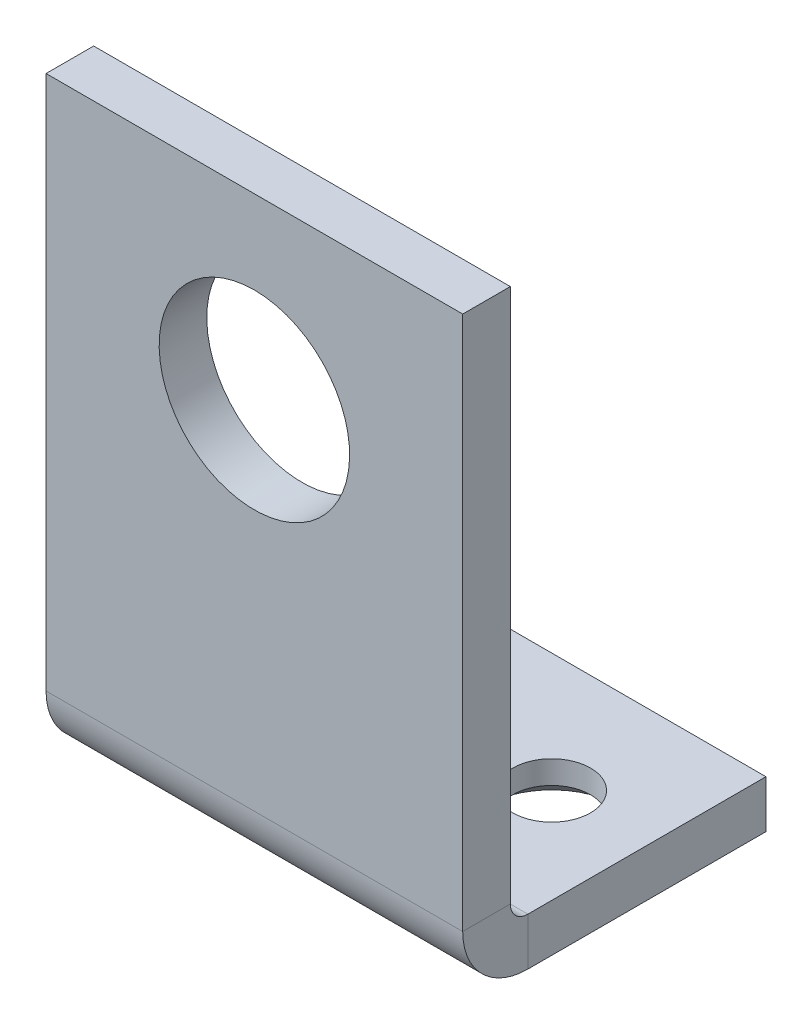
ISO-10303-21;
HEADER;
FILE_DESCRIPTION(('STEP AP214'),'2;1');
FILE_NAME('part.step','',(''),(''),'','','');
FILE_SCHEMA(('AUTOMOTIVE_DESIGN { 1 0 10303 214 1 1 1 1 }'));
ENDSEC;
DATA;
#1=APPLICATION_CONTEXT('core data for automotive mechanical design processes');
#2=APPLICATION_PROTOCOL_DEFINITION('international standard','automotive_design',2000,#1);
#3=PRODUCT_CONTEXT('',#1,'mechanical');
#4=PRODUCT('Part','Part','',(#3));
#5=PRODUCT_RELATED_PRODUCT_CATEGORY('part','',(#4));
#6=PRODUCT_DEFINITION_FORMATION('','',#4);
#7=PRODUCT_DEFINITION_CONTEXT('part definition',#1,'design');
#8=PRODUCT_DEFINITION('design','',#6,#7);
#9=PRODUCT_DEFINITION_SHAPE('','',#8);
#10=(LENGTH_UNIT() NAMED_UNIT(*) SI_UNIT(.MILLI.,.METRE.));
#11=(NAMED_UNIT(*) PLANE_ANGLE_UNIT() SI_UNIT($,.RADIAN.));
#12=(NAMED_UNIT(*) SI_UNIT($,.STERADIAN.) SOLID_ANGLE_UNIT());
#13=UNCERTAINTY_MEASURE_WITH_UNIT(LENGTH_MEASURE(1.E-05),#10,'distance_accuracy_value','');
#14=(GEOMETRIC_REPRESENTATION_CONTEXT(3) GLOBAL_UNCERTAINTY_ASSIGNED_CONTEXT((#13)) GLOBAL_UNIT_ASSIGNED_CONTEXT((#10,
#11,#12)) REPRESENTATION_CONTEXT('',''));
#15=CARTESIAN_POINT('',(0.,0.,0.));
#16=DIRECTION('',(0.,0.,1.));
#17=DIRECTION('',(1.,0.,0.));
#18=AXIS2_PLACEMENT_3D('',#15,#16,#17);
#19=CARTESIAN_POINT('',(0.,0.,0.));
#20=DIRECTION('',(0.,1.,0.));
#21=DIRECTION('',(0.,0.,1.));
#22=AXIS2_PLACEMENT_3D('',#19,#20,#21);
#23=PLANE('',#22);
#24=CARTESIAN_POINT('',(-19.2867132867133,0.,-16.3298368298368));
#25=DIRECTION('',(0.,1.,0.));
#26=DIRECTION('',(0.,0.,1.));
#27=AXIS2_PLACEMENT_3D('',#24,#25,#26);
#28=CIRCLE('',#27,1.63195);
#29=CARTESIAN_POINT('',(-19.2867132867133,0.,-14.6978868298368));
#30=VERTEX_POINT('',#29);
#31=EDGE_CURVE('E402',#30,#30,#28,.F.);
#32=ORIENTED_EDGE('',*,*,#31,.T.);
#33=EDGE_LOOP('',(#32));
#34=FACE_BOUND('',#33,.T.);
#35=DIRECTION('',(-1.,0.,0.));
#36=VECTOR('',#35,1.);
#37=CARTESIAN_POINT('',(0.,0.,-11.3298368298368));
#38=LINE('',#37,#36);
#39=CARTESIAN_POINT('',(-5.78671328671329,0.,-11.3298368298368));
#40=VERTEX_POINT('',#39);
#41=CARTESIAN_POINT('',(-23.2867132867133,0.,-11.3298368298368));
#42=VERTEX_POINT('',#41);
#43=EDGE_CURVE('E148',#40,#42,#38,.T.);
#44=ORIENTED_EDGE('',*,*,#43,.F.);
#45=DIRECTION('',(0.,0.,-1.));
#46=VECTOR('',#45,1.);
#47=CARTESIAN_POINT('',(-5.78671328671329,0.,-21.3298368298368));
#48=LINE('',#47,#46);
#49=CARTESIAN_POINT('',(-5.78671328671329,0.,-21.3298368298368));
#50=VERTEX_POINT('',#49);
#51=EDGE_CURVE('E170',#40,#50,#48,.T.);
#52=ORIENTED_EDGE('',*,*,#51,.T.);
#53=DIRECTION('',(-1.,0.,0.));
#54=VECTOR('',#53,1.);
#55=CARTESIAN_POINT('',(-23.2867132867133,0.,-21.3298368298368));
#56=LINE('',#55,#54);
#57=CARTESIAN_POINT('',(-23.2867132867133,0.,-21.3298368298368));
#58=VERTEX_POINT('',#57);
#59=EDGE_CURVE('E167',#50,#58,#56,.T.);
#60=ORIENTED_EDGE('',*,*,#59,.T.);
#61=DIRECTION('',(0.,0.,1.));
#62=VECTOR('',#61,1.);
#63=CARTESIAN_POINT('',(-23.2867132867133,0.,-21.3298368298368));
#64=LINE('',#63,#62);
#65=EDGE_CURVE('E165',#58,#42,#64,.T.);
#66=ORIENTED_EDGE('',*,*,#65,.T.);
#67=EDGE_LOOP('',(#44,#52,#60,#66));
#68=FACE_BOUND('',#67,.T.);
#69=CARTESIAN_POINT('',(-9.78671328671329,0.,-16.3298368298368));
#70=DIRECTION('',(0.,1.,0.));
#71=DIRECTION('',(0.,0.,1.));
#72=AXIS2_PLACEMENT_3D('',#69,#70,#71);
#73=CIRCLE('',#72,1.63195);
#74=CARTESIAN_POINT('',(-9.78671328671329,0.,-14.6978868298368));
#75=VERTEX_POINT('',#74);
#76=EDGE_CURVE('E409',#75,#75,#73,.F.);
#77=ORIENTED_EDGE('',*,*,#76,.T.);
#78=EDGE_LOOP('',(#77));
#79=FACE_BOUND('',#78,.T.);
#80=ADVANCED_FACE('F47',(#34,#68,#79),#23,.T.);
#81=CARTESIAN_POINT('',(-23.2867132867133,-11.8027493418966,-8.59323682983679));
#82=DIRECTION('',(-1.,0.,0.));
#83=DIRECTION('',(0.,1.,0.));
#84=AXIS2_PLACEMENT_3D('',#81,#82,#83);
#85=PLANE('',#84);
#86=DIRECTION('',(0.,1.,0.));
#87=VECTOR('',#86,1.);
#88=CARTESIAN_POINT('',(-23.2867132867133,-11.8027493418966,-10.5932368298368));
#89=LINE('',#88,#87);
#90=CARTESIAN_POINT('',(-23.2867132867133,0.736600000000002,-10.5932368298368));
#91=VERTEX_POINT('',#90);
#92=CARTESIAN_POINT('',(-23.2867132867133,23.1972506581034,-10.5932368298369));
#93=VERTEX_POINT('',#92);
#94=EDGE_CURVE('E71',#91,#93,#89,.T.);
#95=ORIENTED_EDGE('',*,*,#94,.F.);
#96=DIRECTION('',(0.,0.,1.));
#97=VECTOR('',#96,1.);
#98=CARTESIAN_POINT('',(-23.2867132867133,0.736600000000009,-8.59323682983683));
#99=LINE('',#98,#97);
#100=CARTESIAN_POINT('',(-23.2867132867133,0.73660000000001,-8.59323682983683));
#101=VERTEX_POINT('',#100);
#102=EDGE_CURVE('E112',#91,#101,#99,.T.);
#103=ORIENTED_EDGE('',*,*,#102,.T.);
#104=DIRECTION('',(0.,1.,0.));
#105=VECTOR('',#104,1.);
#106=CARTESIAN_POINT('',(-23.2867132867133,-11.8027493418966,-8.59323682983679));
#107=LINE('',#106,#105);
#108=CARTESIAN_POINT('',(-23.2867132867133,23.1972506581034,-8.59323682983691));
#109=VERTEX_POINT('',#108);
#110=EDGE_CURVE('E51',#101,#109,#107,.T.);
#111=ORIENTED_EDGE('',*,*,#110,.T.);
#112=DIRECTION('',(0.,0.,-1.));
#113=VECTOR('',#112,1.);
#114=CARTESIAN_POINT('',(-23.2867132867133,23.1972506581034,-8.59323682983691));
#115=LINE('',#114,#113);
#116=EDGE_CURVE('E195',#109,#93,#115,.T.);
#117=ORIENTED_EDGE('',*,*,#116,.T.);
#118=EDGE_LOOP('',(#95,#103,#111,#117));
#119=FACE_BOUND('',#118,.T.);
#120=ADVANCED_FACE('F114',(#119),#85,.T.);
#121=CARTESIAN_POINT('',(-5.78671328671329,-11.8027493418966,-8.59323682983679));
#122=DIRECTION('',(1.,0.,0.));
#123=DIRECTION('',(0.,-1.,0.));
#124=AXIS2_PLACEMENT_3D('',#121,#122,#123);
#125=PLANE('',#124);
#126=DIRECTION('',(0.,-1.,0.));
#127=VECTOR('',#126,1.);
#128=CARTESIAN_POINT('',(-5.78671328671329,-11.8027493418966,-8.59323682983679));
#129=LINE('',#128,#127);
#130=CARTESIAN_POINT('',(-5.78671328671328,23.1972506581034,-8.59323682983691));
#131=VERTEX_POINT('',#130);
#132=CARTESIAN_POINT('',(-5.78671328671329,0.736600000000009,-8.59323682983683));
#133=VERTEX_POINT('',#132);
#134=EDGE_CURVE('E191',#131,#133,#129,.T.);
#135=ORIENTED_EDGE('',*,*,#134,.T.);
#136=DIRECTION('',(0.,0.,-1.));
#137=VECTOR('',#136,1.);
#138=CARTESIAN_POINT('',(-5.78671328671329,0.736600000000009,-8.59323682983683));
#139=LINE('',#138,#137);
#140=CARTESIAN_POINT('',(-5.78671328671329,0.736600000000002,-10.5932368298368));
#141=VERTEX_POINT('',#140);
#142=EDGE_CURVE('E12',#133,#141,#139,.T.);
#143=ORIENTED_EDGE('',*,*,#142,.T.);
#144=DIRECTION('',(0.,-1.,0.));
#145=VECTOR('',#144,1.);
#146=CARTESIAN_POINT('',(-5.78671328671329,-11.8027493418966,-10.5932368298368));
#147=LINE('',#146,#145);
#148=CARTESIAN_POINT('',(-5.78671328671328,23.1972506581034,-10.5932368298369));
#149=VERTEX_POINT('',#148);
#150=EDGE_CURVE('E64',#149,#141,#147,.T.);
#151=ORIENTED_EDGE('',*,*,#150,.F.);
#152=DIRECTION('',(0.,0.,-1.));
#153=VECTOR('',#152,1.);
#154=CARTESIAN_POINT('',(-5.78671328671328,23.1972506581034,-8.59323682983691));
#155=LINE('',#154,#153);
#156=EDGE_CURVE('E139',#131,#149,#155,.T.);
#157=ORIENTED_EDGE('',*,*,#156,.F.);
#158=EDGE_LOOP('',(#135,#143,#151,#157));
#159=FACE_BOUND('',#158,.T.);
#160=ADVANCED_FACE('F49',(#159),#125,.T.);
#161=CARTESIAN_POINT('',(0.,9.52708748794019,-10.5932368298369));
#162=DIRECTION('',(0.,0.,-1.));
#163=DIRECTION('',(0.,1.,0.));
#164=AXIS2_PLACEMENT_3D('',#161,#162,#163);
#165=PLANE('',#164);
#166=CARTESIAN_POINT('',(-14.5367132867133,15.6972506581034,-10.5932368298369));
#167=DIRECTION('',(0.,0.,-1.));
#168=DIRECTION('',(0.,1.,0.));
#169=AXIS2_PLACEMENT_3D('',#166,#167,#168);
#170=CIRCLE('',#169,4.);
#171=CARTESIAN_POINT('',(-14.5367132867133,19.6972506581034,-10.5932368298369));
#172=VERTEX_POINT('',#171);
#173=EDGE_CURVE('E162',#172,#172,#170,.T.);
#174=ORIENTED_EDGE('',*,*,#173,.F.);
#175=EDGE_LOOP('',(#174));
#176=FACE_BOUND('',#175,.T.);
#177=ORIENTED_EDGE('',*,*,#150,.T.);
#178=DIRECTION('',(-1.,0.,0.));
#179=VECTOR('',#178,1.);
#180=CARTESIAN_POINT('',(0.,0.736600000000002,-10.5932368298368));
#181=LINE('',#180,#179);
#182=EDGE_CURVE('E56',#141,#91,#181,.T.);
#183=ORIENTED_EDGE('',*,*,#182,.T.);
#184=ORIENTED_EDGE('',*,*,#94,.T.);
#185=DIRECTION('',(1.,0.,0.));
#186=VECTOR('',#185,1.);
#187=CARTESIAN_POINT('',(-23.2867132867133,23.1972506581034,-10.5932368298369));
#188=LINE('',#187,#186);
#189=EDGE_CURVE('E192',#93,#149,#188,.T.);
#190=ORIENTED_EDGE('',*,*,#189,.T.);
#191=EDGE_LOOP('',(#177,#183,#184,#190));
#192=FACE_BOUND('',#191,.T.);
#193=ADVANCED_FACE('F199',(#176,#192),#165,.T.);
#194=CARTESIAN_POINT('',(-23.2867132867133,23.1972506581034,-8.59323682983691));
#195=DIRECTION('',(0.,1.,0.));
#196=DIRECTION('',(1.,0.,0.));
#197=AXIS2_PLACEMENT_3D('',#194,#195,#196);
#198=PLANE('',#197);
#199=ORIENTED_EDGE('',*,*,#189,.F.);
#200=ORIENTED_EDGE('',*,*,#116,.F.);
#201=DIRECTION('',(1.,0.,0.));
#202=VECTOR('',#201,1.);
#203=CARTESIAN_POINT('',(-23.2867132867133,23.1972506581034,-8.59323682983691));
#204=LINE('',#203,#202);
#205=EDGE_CURVE('E130',#109,#131,#204,.T.);
#206=ORIENTED_EDGE('',*,*,#205,.T.);
#207=ORIENTED_EDGE('',*,*,#156,.T.);
#208=EDGE_LOOP('',(#199,#200,#206,#207));
#209=FACE_BOUND('',#208,.T.);
#210=ADVANCED_FACE('F203',(#209),#198,.T.);
#211=CARTESIAN_POINT('',(0.,9.5270874879402,-8.59323682983686));
#212=DIRECTION('',(0.,0.,-1.));
#213=DIRECTION('',(0.,1.,0.));
#214=AXIS2_PLACEMENT_3D('',#211,#212,#213);
#215=PLANE('',#214);
#216=DIRECTION('',(-1.,0.,0.));
#217=VECTOR('',#216,1.);
#218=CARTESIAN_POINT('',(0.,0.736600000000009,-8.59323682983683));
#219=LINE('',#218,#217);
#220=EDGE_CURVE('E120',#133,#101,#219,.T.);
#221=ORIENTED_EDGE('',*,*,#220,.F.);
#222=ORIENTED_EDGE('',*,*,#134,.F.);
#223=ORIENTED_EDGE('',*,*,#205,.F.);
#224=ORIENTED_EDGE('',*,*,#110,.F.);
#225=EDGE_LOOP('',(#221,#222,#223,#224));
#226=FACE_BOUND('',#225,.T.);
#227=CARTESIAN_POINT('',(-14.5367132867133,15.6972506581034,-8.59323682983688));
#228=DIRECTION('',(0.,0.,-1.));
#229=DIRECTION('',(0.,1.,0.));
#230=AXIS2_PLACEMENT_3D('',#227,#228,#229);
#231=CIRCLE('',#230,4.);
#232=CARTESIAN_POINT('',(-14.5367132867133,19.6972506581034,-8.59323682983689));
#233=VERTEX_POINT('',#232);
#234=EDGE_CURVE('E187',#233,#233,#231,.F.);
#235=ORIENTED_EDGE('',*,*,#234,.F.);
#236=EDGE_LOOP('',(#235));
#237=FACE_BOUND('',#236,.T.);
#238=ADVANCED_FACE('F125',(#226,#237),#215,.F.);
#239=CARTESIAN_POINT('',(-14.5367132867133,15.6972506581034,2.72047166914788));
#240=DIRECTION('',(0.,0.,-1.));
#241=DIRECTION('',(0.,1.,0.));
#242=AXIS2_PLACEMENT_3D('',#239,#240,#241);
#243=CYLINDRICAL_SURFACE('',#242,4.);
#244=ORIENTED_EDGE('',*,*,#234,.T.);
#245=EDGE_LOOP('',(#244));
#246=FACE_BOUND('',#245,.T.);
#247=ORIENTED_EDGE('',*,*,#173,.T.);
#248=EDGE_LOOP('',(#247));
#249=FACE_BOUND('',#248,.T.);
#250=ADVANCED_FACE('F229',(#246,#249),#243,.F.);
#251=CARTESIAN_POINT('',(-23.2867132867133,-2.,-21.3298368298368));
#252=DIRECTION('',(0.,0.,-1.));
#253=DIRECTION('',(-1.,0.,0.));
#254=AXIS2_PLACEMENT_3D('',#251,#252,#253);
#255=PLANE('',#254);
#256=ORIENTED_EDGE('',*,*,#59,.F.);
#257=DIRECTION('',(0.,1.,0.));
#258=VECTOR('',#257,1.);
#259=CARTESIAN_POINT('',(-5.78671328671329,-2.,-21.3298368298368));
#260=LINE('',#259,#258);
#261=CARTESIAN_POINT('',(-5.78671328671329,-2.,-21.3298368298368));
#262=VERTEX_POINT('',#261);
#263=EDGE_CURVE('E159',#262,#50,#260,.T.);
#264=ORIENTED_EDGE('',*,*,#263,.F.);
#265=DIRECTION('',(-1.,0.,0.));
#266=VECTOR('',#265,1.);
#267=CARTESIAN_POINT('',(-23.2867132867133,-2.,-21.3298368298368));
#268=LINE('',#267,#266);
#269=CARTESIAN_POINT('',(-23.2867132867133,-2.,-21.3298368298368));
#270=VERTEX_POINT('',#269);
#271=EDGE_CURVE('E179',#262,#270,#268,.T.);
#272=ORIENTED_EDGE('',*,*,#271,.T.);
#273=DIRECTION('',(0.,1.,0.));
#274=VECTOR('',#273,1.);
#275=CARTESIAN_POINT('',(-23.2867132867133,-2.,-21.3298368298368));
#276=LINE('',#275,#274);
#277=EDGE_CURVE('E177',#270,#58,#276,.T.);
#278=ORIENTED_EDGE('',*,*,#277,.T.);
#279=EDGE_LOOP('',(#256,#264,#272,#278));
#280=FACE_BOUND('',#279,.T.);
#281=ADVANCED_FACE('F227',(#280),#255,.T.);
#282=CARTESIAN_POINT('',(0.,-2.,0.));
#283=DIRECTION('',(0.,1.,0.));
#284=DIRECTION('',(0.,0.,1.));
#285=AXIS2_PLACEMENT_3D('',#282,#283,#284);
#286=PLANE('',#285);
#287=CARTESIAN_POINT('',(-19.2867132867133,-2.,-16.3298368298368));
#288=DIRECTION('',(0.,-1.,0.));
#289=DIRECTION('',(0.,0.,-1.));
#290=AXIS2_PLACEMENT_3D('',#287,#288,#289);
#291=CIRCLE('',#290,2.8575);
#292=CARTESIAN_POINT('',(-19.2867132867133,-2.,-19.1873368298368));
#293=VERTEX_POINT('',#292);
#294=EDGE_CURVE('E401',#293,#293,#291,.T.);
#295=ORIENTED_EDGE('',*,*,#294,.F.);
#296=EDGE_LOOP('',(#295));
#297=FACE_BOUND('',#296,.T.);
#298=CARTESIAN_POINT('',(-9.78671328671329,-2.,-16.3298368298368));
#299=DIRECTION('',(0.,-1.,0.));
#300=DIRECTION('',(0.,0.,-1.));
#301=AXIS2_PLACEMENT_3D('',#298,#299,#300);
#302=CIRCLE('',#301,2.8575);
#303=CARTESIAN_POINT('',(-9.78671328671329,-2.,-19.1873368298368));
#304=VERTEX_POINT('',#303);
#305=EDGE_CURVE('E410',#304,#304,#302,.T.);
#306=ORIENTED_EDGE('',*,*,#305,.F.);
#307=EDGE_LOOP('',(#306));
#308=FACE_BOUND('',#307,.T.);
#309=DIRECTION('',(0.,0.,-1.));
#310=VECTOR('',#309,1.);
#311=CARTESIAN_POINT('',(-5.78671328671329,-2.,-21.3298368298368));
#312=LINE('',#311,#310);
#313=CARTESIAN_POINT('',(-5.78671328671329,-2.,-11.3298368298368));
#314=VERTEX_POINT('',#313);
#315=EDGE_CURVE('E163',#314,#262,#312,.T.);
#316=ORIENTED_EDGE('',*,*,#315,.F.);
#317=DIRECTION('',(-1.,0.,0.));
#318=VECTOR('',#317,1.);
#319=CARTESIAN_POINT('',(0.,-2.,-11.3298368298368));
#320=LINE('',#319,#318);
#321=CARTESIAN_POINT('',(-23.2867132867133,-2.,-11.3298368298368));
#322=VERTEX_POINT('',#321);
#323=EDGE_CURVE('E174',#314,#322,#320,.T.);
#324=ORIENTED_EDGE('',*,*,#323,.T.);
#325=DIRECTION('',(0.,0.,1.));
#326=VECTOR('',#325,1.);
#327=CARTESIAN_POINT('',(-23.2867132867133,-2.,-21.3298368298368));
#328=LINE('',#327,#326);
#329=EDGE_CURVE('E172',#270,#322,#328,.T.);
#330=ORIENTED_EDGE('',*,*,#329,.F.);
#331=ORIENTED_EDGE('',*,*,#271,.F.);
#332=EDGE_LOOP('',(#316,#324,#330,#331));
#333=FACE_BOUND('',#332,.T.);
#334=ADVANCED_FACE('F225',(#297,#308,#333),#286,.F.);
#335=CARTESIAN_POINT('',(-23.2867132867133,-2.,-21.3298368298368));
#336=DIRECTION('',(-1.,0.,0.));
#337=DIRECTION('',(0.,0.,1.));
#338=AXIS2_PLACEMENT_3D('',#335,#336,#337);
#339=PLANE('',#338);
#340=DIRECTION('',(0.,-1.,0.));
#341=VECTOR('',#340,1.);
#342=CARTESIAN_POINT('',(-23.2867132867133,-2.,-11.3298368298368));
#343=LINE('',#342,#341);
#344=EDGE_CURVE('E144',#42,#322,#343,.T.);
#345=ORIENTED_EDGE('',*,*,#344,.F.);
#346=ORIENTED_EDGE('',*,*,#65,.F.);
#347=ORIENTED_EDGE('',*,*,#277,.F.);
#348=ORIENTED_EDGE('',*,*,#329,.T.);
#349=EDGE_LOOP('',(#345,#346,#347,#348));
#350=FACE_BOUND('',#349,.T.);
#351=ADVANCED_FACE('F221',(#350),#339,.T.);
#352=CARTESIAN_POINT('',(-5.78671328671329,-2.,-21.3298368298368));
#353=DIRECTION('',(1.,0.,0.));
#354=DIRECTION('',(0.,0.,-1.));
#355=AXIS2_PLACEMENT_3D('',#352,#353,#354);
#356=PLANE('',#355);
#357=DIRECTION('',(0.,1.,0.));
#358=VECTOR('',#357,1.);
#359=CARTESIAN_POINT('',(-5.78671328671329,-2.,-11.3298368298368));
#360=LINE('',#359,#358);
#361=EDGE_CURVE('E145',#314,#40,#360,.T.);
#362=ORIENTED_EDGE('',*,*,#361,.F.);
#363=ORIENTED_EDGE('',*,*,#315,.T.);
#364=ORIENTED_EDGE('',*,*,#263,.T.);
#365=ORIENTED_EDGE('',*,*,#51,.F.);
#366=EDGE_LOOP('',(#362,#363,#364,#365));
#367=FACE_BOUND('',#366,.T.);
#368=ADVANCED_FACE('F213',(#367),#356,.T.);
#369=CARTESIAN_POINT('',(-5.78671328671329,0.7366,-11.3298368298368));
#370=DIRECTION('',(1.,0.,0.));
#371=DIRECTION('',(0.,0.,-1.));
#372=AXIS2_PLACEMENT_3D('',#369,#370,#371);
#373=PLANE('',#372);
#374=ORIENTED_EDGE('',*,*,#361,.T.);
#375=CARTESIAN_POINT('',(-5.78671328671329,0.7366,-11.3298368298368));
#376=DIRECTION('',(-1.,0.,0.));
#377=DIRECTION('',(0.,0.,1.));
#378=AXIS2_PLACEMENT_3D('',#375,#376,#377);
#379=CIRCLE('',#378,0.7366);
#380=EDGE_CURVE('E155',#40,#141,#379,.T.);
#381=ORIENTED_EDGE('',*,*,#380,.T.);
#382=ORIENTED_EDGE('',*,*,#142,.F.);
#383=CARTESIAN_POINT('',(-5.78671328671329,0.7366,-11.3298368298368));
#384=DIRECTION('',(-1.,0.,0.));
#385=DIRECTION('',(0.,0.,-1.));
#386=AXIS2_PLACEMENT_3D('',#383,#384,#385);
#387=CIRCLE('',#386,2.7366);
#388=EDGE_CURVE('E138',#314,#133,#387,.T.);
#389=ORIENTED_EDGE('',*,*,#388,.F.);
#390=EDGE_LOOP('',(#374,#381,#382,#389));
#391=FACE_BOUND('',#390,.T.);
#392=ADVANCED_FACE('F210',(#391),#373,.T.);
#393=CARTESIAN_POINT('',(-23.2867132867133,0.7366,-11.3298368298368));
#394=DIRECTION('',(-1.,0.,0.));
#395=DIRECTION('',(0.,0.,1.));
#396=AXIS2_PLACEMENT_3D('',#393,#394,#395);
#397=PLANE('',#396);
#398=ORIENTED_EDGE('',*,*,#102,.F.);
#399=CARTESIAN_POINT('',(-23.2867132867133,0.7366,-11.3298368298368));
#400=DIRECTION('',(-1.,0.,0.));
#401=DIRECTION('',(0.,0.,1.));
#402=AXIS2_PLACEMENT_3D('',#399,#400,#401);
#403=CIRCLE('',#402,0.7366);
#404=EDGE_CURVE('E150',#91,#42,#403,.F.);
#405=ORIENTED_EDGE('',*,*,#404,.T.);
#406=ORIENTED_EDGE('',*,*,#344,.T.);
#407=CARTESIAN_POINT('',(-23.2867132867133,0.7366,-11.3298368298368));
#408=DIRECTION('',(1.,0.,0.));
#409=DIRECTION('',(0.,0.,1.));
#410=AXIS2_PLACEMENT_3D('',#407,#408,#409);
#411=CIRCLE('',#410,2.7366);
#412=EDGE_CURVE('E136',#101,#322,#411,.T.);
#413=ORIENTED_EDGE('',*,*,#412,.F.);
#414=EDGE_LOOP('',(#398,#405,#406,#413));
#415=FACE_BOUND('',#414,.T.);
#416=ADVANCED_FACE('F142',(#415),#397,.T.);
#417=CARTESIAN_POINT('',(3.25930579285029,0.7366,-11.3298368298368));
#418=DIRECTION('',(-1.,0.,0.));
#419=DIRECTION('',(0.,0.,1.));
#420=AXIS2_PLACEMENT_3D('',#417,#418,#419);
#421=CYLINDRICAL_SURFACE('',#420,2.7366);
#422=ORIENTED_EDGE('',*,*,#412,.T.);
#423=ORIENTED_EDGE('',*,*,#323,.F.);
#424=ORIENTED_EDGE('',*,*,#388,.T.);
#425=ORIENTED_EDGE('',*,*,#220,.T.);
#426=EDGE_LOOP('',(#422,#423,#424,#425));
#427=FACE_BOUND('',#426,.T.);
#428=ADVANCED_FACE('F134',(#427),#421,.T.);
#429=CARTESIAN_POINT('',(3.25930579285029,0.7366,-11.3298368298368));
#430=DIRECTION('',(-1.,0.,0.));
#431=DIRECTION('',(0.,0.,1.));
#432=AXIS2_PLACEMENT_3D('',#429,#430,#431);
#433=CYLINDRICAL_SURFACE('',#432,0.7366);
#434=ORIENTED_EDGE('',*,*,#404,.F.);
#435=ORIENTED_EDGE('',*,*,#182,.F.);
#436=ORIENTED_EDGE('',*,*,#380,.F.);
#437=ORIENTED_EDGE('',*,*,#43,.T.);
#438=EDGE_LOOP('',(#434,#435,#436,#437));
#439=FACE_BOUND('',#438,.T.);
#440=ADVANCED_FACE('F209',(#439),#433,.F.);
#441=CARTESIAN_POINT('',(-9.78671328671329,-2.,-16.3298368298368));
#442=DIRECTION('',(0.,-1.,0.));
#443=DIRECTION('',(0.,0.,-1.));
#444=AXIS2_PLACEMENT_3D('',#441,#442,#443);
#445=CYLINDRICAL_SURFACE('',#444,1.63195);
#446=ORIENTED_EDGE('',*,*,#76,.F.);
#447=EDGE_LOOP('',(#446));
#448=FACE_BOUND('',#447,.T.);
#449=CARTESIAN_POINT('',(-9.78671328671329,-0.971641447010682,-16.3298368298368));
#450=DIRECTION('',(0.,-1.,0.));
#451=DIRECTION('',(0.,0.,-1.));
#452=AXIS2_PLACEMENT_3D('',#449,#450,#451);
#453=CIRCLE('',#452,1.63195);
#454=CARTESIAN_POINT('',(-9.78671328671329,-0.971641447010682,-17.9617868298368));
#455=VERTEX_POINT('',#454);
#456=EDGE_CURVE('E158',#455,#455,#453,.T.);
#457=ORIENTED_EDGE('',*,*,#456,.T.);
#458=EDGE_LOOP('',(#457));
#459=FACE_BOUND('',#458,.T.);
#460=ADVANCED_FACE('F347',(#448,#459),#445,.F.);
#461=CARTESIAN_POINT('',(-9.78671328671329,-2.,-16.3298368298368));
#462=DIRECTION('',(0.,-1.,0.));
#463=DIRECTION('',(0.,0.,-1.));
#464=AXIS2_PLACEMENT_3D('',#461,#462,#463);
#465=CONICAL_SURFACE('',#464,2.8575,0.872664625997164);
#466=ORIENTED_EDGE('',*,*,#456,.F.);
#467=EDGE_LOOP('',(#466));
#468=FACE_BOUND('',#467,.T.);
#469=ORIENTED_EDGE('',*,*,#305,.T.);
#470=EDGE_LOOP('',(#469));
#471=FACE_BOUND('',#470,.T.);
#472=ADVANCED_FACE('F362',(#468,#471),#465,.F.);
#473=CARTESIAN_POINT('',(-19.2867132867133,-2.,-16.3298368298368));
#474=DIRECTION('',(0.,-1.,0.));
#475=DIRECTION('',(0.,0.,-1.));
#476=AXIS2_PLACEMENT_3D('',#473,#474,#475);
#477=CYLINDRICAL_SURFACE('',#476,1.63195);
#478=ORIENTED_EDGE('',*,*,#31,.F.);
#479=EDGE_LOOP('',(#478));
#480=FACE_BOUND('',#479,.T.);
#481=CARTESIAN_POINT('',(-19.2867132867133,-0.971641447010682,-16.3298368298368));
#482=DIRECTION('',(0.,-1.,0.));
#483=DIRECTION('',(0.,0.,-1.));
#484=AXIS2_PLACEMENT_3D('',#481,#482,#483);
#485=CIRCLE('',#484,1.63195);
#486=CARTESIAN_POINT('',(-19.2867132867133,-0.971641447010682,-17.9617868298368));
#487=VERTEX_POINT('',#486);
#488=EDGE_CURVE('E398',#487,#487,#485,.T.);
#489=ORIENTED_EDGE('',*,*,#488,.T.);
#490=EDGE_LOOP('',(#489));
#491=FACE_BOUND('',#490,.T.);
#492=ADVANCED_FACE('F372',(#480,#491),#477,.F.);
#493=CARTESIAN_POINT('',(-19.2867132867133,-2.,-16.3298368298368));
#494=DIRECTION('',(0.,-1.,0.));
#495=DIRECTION('',(0.,0.,-1.));
#496=AXIS2_PLACEMENT_3D('',#493,#494,#495);
#497=CONICAL_SURFACE('',#496,2.8575,0.872664625997164);
#498=ORIENTED_EDGE('',*,*,#488,.F.);
#499=EDGE_LOOP('',(#498));
#500=FACE_BOUND('',#499,.T.);
#501=ORIENTED_EDGE('',*,*,#294,.T.);
#502=EDGE_LOOP('',(#501));
#503=FACE_BOUND('',#502,.T.);
#504=ADVANCED_FACE('F382',(#500,#503),#497,.F.);
#505=CLOSED_SHELL('',(#80,#120,#160,#193,#210,#238,#250,#281,#334,#351,#368,#392,#416,#428,#440,
#460,#472,#492,#504));
#506=MANIFOLD_SOLID_BREP('B2',#505);
#507=ADVANCED_BREP_SHAPE_REPRESENTATION('',(#18,#506),#14);
#508=SHAPE_DEFINITION_REPRESENTATION(#9,#507);
ENDSEC;
END-ISO-10303-21;
